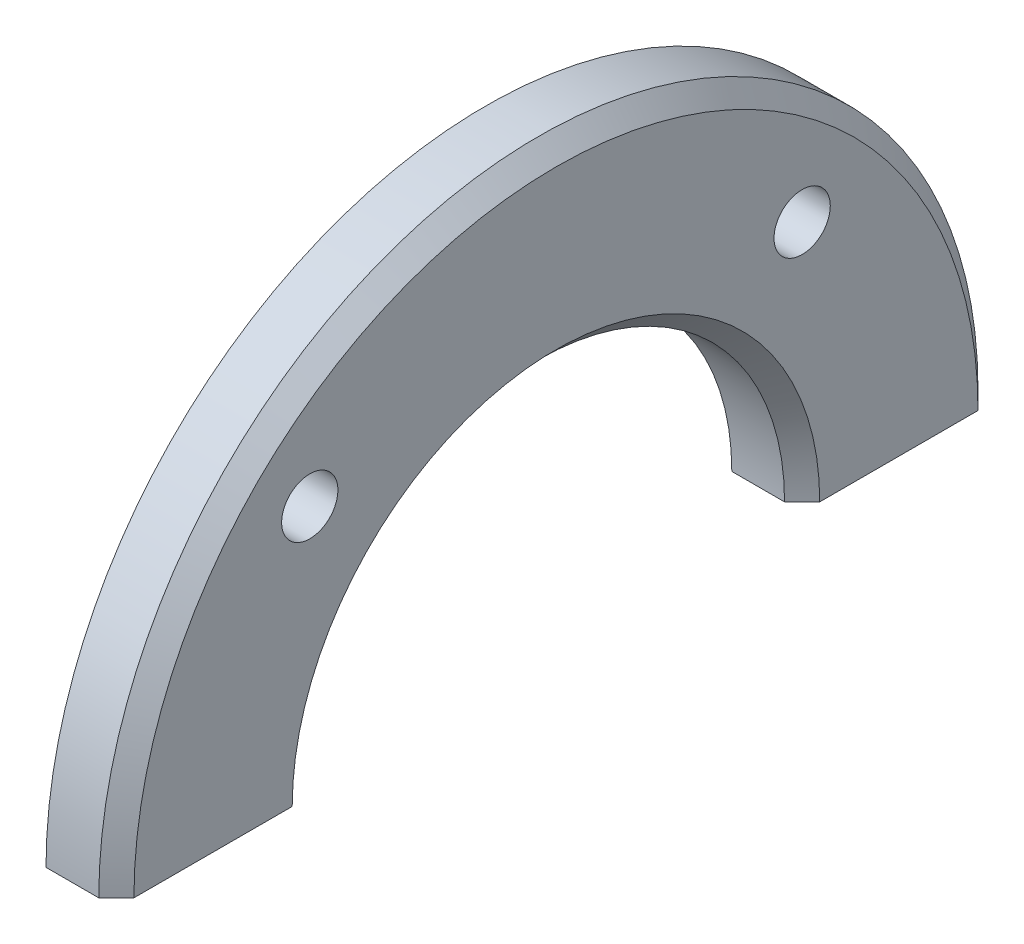
ISO-10303-21;
HEADER;
FILE_DESCRIPTION(('STEP AP214'),'2;1');
FILE_NAME('part.step','',(''),(''),'','','');
FILE_SCHEMA(('AUTOMOTIVE_DESIGN { 1 0 10303 214 1 1 1 1 }'));
ENDSEC;
DATA;
#1=APPLICATION_CONTEXT('core data for automotive mechanical design processes');
#2=APPLICATION_PROTOCOL_DEFINITION('international standard','automotive_design',2000,#1);
#3=PRODUCT_CONTEXT('',#1,'mechanical');
#4=PRODUCT('Part','Part','',(#3));
#5=PRODUCT_RELATED_PRODUCT_CATEGORY('part','',(#4));
#6=PRODUCT_DEFINITION_FORMATION('','',#4);
#7=PRODUCT_DEFINITION_CONTEXT('part definition',#1,'design');
#8=PRODUCT_DEFINITION('design','',#6,#7);
#9=PRODUCT_DEFINITION_SHAPE('','',#8);
#10=(LENGTH_UNIT() NAMED_UNIT(*) SI_UNIT(.MILLI.,.METRE.));
#11=(NAMED_UNIT(*) PLANE_ANGLE_UNIT() SI_UNIT($,.RADIAN.));
#12=(NAMED_UNIT(*) SI_UNIT($,.STERADIAN.) SOLID_ANGLE_UNIT());
#13=UNCERTAINTY_MEASURE_WITH_UNIT(LENGTH_MEASURE(1.E-05),#10,'distance_accuracy_value','');
#14=(GEOMETRIC_REPRESENTATION_CONTEXT(3) GLOBAL_UNCERTAINTY_ASSIGNED_CONTEXT((#13)) GLOBAL_UNIT_ASSIGNED_CONTEXT((#10,
#11,#12)) REPRESENTATION_CONTEXT('',''));
#15=CARTESIAN_POINT('',(0.,0.,0.));
#16=DIRECTION('',(0.,0.,1.));
#17=DIRECTION('',(1.,0.,0.));
#18=AXIS2_PLACEMENT_3D('',#15,#16,#17);
#19=CARTESIAN_POINT('',(4.,0.,0.));
#20=DIRECTION('',(1.,0.,0.));
#21=DIRECTION('',(0.,0.,-1.));
#22=AXIS2_PLACEMENT_3D('',#19,#20,#21);
#23=PLANE('',#22);
#24=CARTESIAN_POINT('',(4.,14.2828568570857,-14.));
#25=DIRECTION('',(1.,0.,0.));
#26=DIRECTION('',(0.,0.,-1.));
#27=AXIS2_PLACEMENT_3D('',#24,#25,#26);
#28=CIRCLE('',#27,1.6);
#29=CARTESIAN_POINT('',(4.,14.2828568570857,-15.6));
#30=VERTEX_POINT('',#29);
#31=EDGE_CURVE('E125',#30,#30,#28,.T.);
#32=ORIENTED_EDGE('',*,*,#31,.F.);
#33=EDGE_LOOP('',(#32));
#34=FACE_BOUND('',#33,.T.);
#35=DIRECTION('',(0.,0.,-1.));
#36=VECTOR('',#35,1.);
#37=CARTESIAN_POINT('',(4.,0.,14.));
#38=LINE('',#37,#36);
#39=CARTESIAN_POINT('',(4.,0.,24.));
#40=VERTEX_POINT('',#39);
#41=CARTESIAN_POINT('',(4.,0.,15.));
#42=VERTEX_POINT('',#41);
#43=EDGE_CURVE('E132',#40,#42,#38,.T.);
#44=ORIENTED_EDGE('',*,*,#43,.T.);
#45=CARTESIAN_POINT('',(4.,0.,0.));
#46=DIRECTION('',(1.,0.,0.));
#47=DIRECTION('',(0.,0.,-1.));
#48=AXIS2_PLACEMENT_3D('',#45,#46,#47);
#49=CIRCLE('',#48,15.);
#50=CARTESIAN_POINT('',(4.,0.,-15.));
#51=VERTEX_POINT('',#50);
#52=EDGE_CURVE('E151',#42,#51,#49,.F.);
#53=ORIENTED_EDGE('',*,*,#52,.T.);
#54=DIRECTION('',(0.,0.,-1.));
#55=VECTOR('',#54,1.);
#56=CARTESIAN_POINT('',(4.,0.,-14.));
#57=LINE('',#56,#55);
#58=CARTESIAN_POINT('',(4.,0.,-24.));
#59=VERTEX_POINT('',#58);
#60=EDGE_CURVE('E140',#51,#59,#57,.T.);
#61=ORIENTED_EDGE('',*,*,#60,.T.);
#62=CARTESIAN_POINT('',(4.,0.,0.));
#63=DIRECTION('',(1.,0.,0.));
#64=DIRECTION('',(0.,0.,-1.));
#65=AXIS2_PLACEMENT_3D('',#62,#63,#64);
#66=CIRCLE('',#65,24.);
#67=EDGE_CURVE('E108',#59,#40,#66,.T.);
#68=ORIENTED_EDGE('',*,*,#67,.T.);
#69=EDGE_LOOP('',(#44,#53,#61,#68));
#70=FACE_BOUND('',#69,.T.);
#71=CARTESIAN_POINT('',(4.,14.2828568570857,14.));
#72=DIRECTION('',(1.,0.,0.));
#73=DIRECTION('',(0.,0.,-1.));
#74=AXIS2_PLACEMENT_3D('',#71,#72,#73);
#75=CIRCLE('',#74,1.6);
#76=CARTESIAN_POINT('',(4.,14.2828568570857,12.4));
#77=VERTEX_POINT('',#76);
#78=EDGE_CURVE('E293',#77,#77,#75,.T.);
#79=ORIENTED_EDGE('',*,*,#78,.F.);
#80=EDGE_LOOP('',(#79));
#81=FACE_BOUND('',#80,.T.);
#82=ADVANCED_FACE('F44',(#34,#70,#81),#23,.T.);
#83=CARTESIAN_POINT('',(0.,0.,0.));
#84=DIRECTION('',(1.,0.,0.));
#85=DIRECTION('',(0.,0.,-1.));
#86=AXIS2_PLACEMENT_3D('',#83,#84,#85);
#87=PLANE('',#86);
#88=CARTESIAN_POINT('',(0.,0.,0.));
#89=DIRECTION('',(-1.,0.,0.));
#90=DIRECTION('',(0.,0.,-1.));
#91=AXIS2_PLACEMENT_3D('',#88,#89,#90);
#92=CIRCLE('',#91,14.);
#93=CARTESIAN_POINT('',(0.,0.,14.));
#94=VERTEX_POINT('',#93);
#95=CARTESIAN_POINT('',(0.,0.,-14.));
#96=VERTEX_POINT('',#95);
#97=EDGE_CURVE('E116',#94,#96,#92,.T.);
#98=ORIENTED_EDGE('',*,*,#97,.F.);
#99=DIRECTION('',(0.,0.,-1.));
#100=VECTOR('',#99,1.);
#101=CARTESIAN_POINT('',(0.,0.,14.));
#102=LINE('',#101,#100);
#103=CARTESIAN_POINT('',(0.,0.,25.));
#104=VERTEX_POINT('',#103);
#105=EDGE_CURVE('E137',#104,#94,#102,.T.);
#106=ORIENTED_EDGE('',*,*,#105,.F.);
#107=CARTESIAN_POINT('',(0.,0.,0.));
#108=DIRECTION('',(1.,0.,0.));
#109=DIRECTION('',(0.,0.,-1.));
#110=AXIS2_PLACEMENT_3D('',#107,#108,#109);
#111=CIRCLE('',#110,25.);
#112=CARTESIAN_POINT('',(0.,0.,-25.));
#113=VERTEX_POINT('',#112);
#114=EDGE_CURVE('E118',#113,#104,#111,.T.);
#115=ORIENTED_EDGE('',*,*,#114,.F.);
#116=DIRECTION('',(0.,0.,-1.));
#117=VECTOR('',#116,1.);
#118=CARTESIAN_POINT('',(0.,0.,-14.));
#119=LINE('',#118,#117);
#120=EDGE_CURVE('E103',#96,#113,#119,.T.);
#121=ORIENTED_EDGE('',*,*,#120,.F.);
#122=EDGE_LOOP('',(#98,#106,#115,#121));
#123=FACE_BOUND('',#122,.T.);
#124=CARTESIAN_POINT('',(0.,14.2828568570857,-14.));
#125=DIRECTION('',(1.,0.,0.));
#126=DIRECTION('',(0.,0.,-1.));
#127=AXIS2_PLACEMENT_3D('',#124,#125,#126);
#128=CIRCLE('',#127,1.6);
#129=CARTESIAN_POINT('',(0.,14.2828568570857,-15.6));
#130=VERTEX_POINT('',#129);
#131=EDGE_CURVE('E129',#130,#130,#128,.T.);
#132=ORIENTED_EDGE('',*,*,#131,.T.);
#133=EDGE_LOOP('',(#132));
#134=FACE_BOUND('',#133,.T.);
#135=CARTESIAN_POINT('',(0.,14.2828568570857,14.));
#136=DIRECTION('',(1.,0.,0.));
#137=DIRECTION('',(0.,0.,-1.));
#138=AXIS2_PLACEMENT_3D('',#135,#136,#137);
#139=CIRCLE('',#138,1.6);
#140=CARTESIAN_POINT('',(0.,14.2828568570857,12.4));
#141=VERTEX_POINT('',#140);
#142=EDGE_CURVE('E297',#141,#141,#139,.T.);
#143=ORIENTED_EDGE('',*,*,#142,.T.);
#144=EDGE_LOOP('',(#143));
#145=FACE_BOUND('',#144,.T.);
#146=ADVANCED_FACE('F113',(#123,#134,#145),#87,.F.);
#147=CARTESIAN_POINT('',(4.,0.,0.));
#148=DIRECTION('',(-1.,0.,0.));
#149=DIRECTION('',(0.,0.,1.));
#150=AXIS2_PLACEMENT_3D('',#147,#148,#149);
#151=CYLINDRICAL_SURFACE('',#150,14.);
#152=DIRECTION('',(-1.,0.,0.));
#153=VECTOR('',#152,1.);
#154=CARTESIAN_POINT('',(4.,0.,-14.));
#155=LINE('',#154,#153);
#156=CARTESIAN_POINT('',(2.99999999999998,0.,-14.));
#157=VERTEX_POINT('',#156);
#158=EDGE_CURVE('E98',#157,#96,#155,.T.);
#159=ORIENTED_EDGE('',*,*,#158,.F.);
#160=CARTESIAN_POINT('',(2.99999999999998,0.,0.));
#161=DIRECTION('',(1.,0.,0.));
#162=DIRECTION('',(0.,0.,-1.));
#163=AXIS2_PLACEMENT_3D('',#160,#161,#162);
#164=CIRCLE('',#163,14.);
#165=CARTESIAN_POINT('',(2.99999999999998,0.,14.));
#166=VERTEX_POINT('',#165);
#167=EDGE_CURVE('E69',#157,#166,#164,.T.);
#168=ORIENTED_EDGE('',*,*,#167,.T.);
#169=DIRECTION('',(-1.,0.,0.));
#170=VECTOR('',#169,1.);
#171=CARTESIAN_POINT('',(4.,0.,14.));
#172=LINE('',#171,#170);
#173=EDGE_CURVE('E122',#166,#94,#172,.T.);
#174=ORIENTED_EDGE('',*,*,#173,.T.);
#175=ORIENTED_EDGE('',*,*,#97,.T.);
#176=EDGE_LOOP('',(#159,#168,#174,#175));
#177=FACE_BOUND('',#176,.T.);
#178=ADVANCED_FACE('F121',(#177),#151,.F.);
#179=CARTESIAN_POINT('',(4.,0.,-14.));
#180=DIRECTION('',(0.,1.,0.));
#181=DIRECTION('',(0.,0.,1.));
#182=AXIS2_PLACEMENT_3D('',#179,#180,#181);
#183=PLANE('',#182);
#184=ORIENTED_EDGE('',*,*,#60,.F.);
#185=DIRECTION('',(-0.707106781186551,0.,0.707106781186544));
#186=VECTOR('',#185,1.);
#187=CARTESIAN_POINT('',(-11.0000000000001,0.,0.));
#188=LINE('',#187,#186);
#189=EDGE_CURVE('E105',#51,#157,#188,.T.);
#190=ORIENTED_EDGE('',*,*,#189,.T.);
#191=ORIENTED_EDGE('',*,*,#158,.T.);
#192=ORIENTED_EDGE('',*,*,#120,.T.);
#193=DIRECTION('',(-1.,0.,0.));
#194=VECTOR('',#193,1.);
#195=CARTESIAN_POINT('',(4.,0.,-25.));
#196=LINE('',#195,#194);
#197=CARTESIAN_POINT('',(3.,0.,-25.));
#198=VERTEX_POINT('',#197);
#199=EDGE_CURVE('E109',#198,#113,#196,.T.);
#200=ORIENTED_EDGE('',*,*,#199,.F.);
#201=DIRECTION('',(-0.707106781186549,0.,-0.707106781186546));
#202=VECTOR('',#201,1.);
#203=CARTESIAN_POINT('',(28.0000000000001,0.,0.));
#204=LINE('',#203,#202);
#205=EDGE_CURVE('E155',#198,#59,#204,.F.);
#206=ORIENTED_EDGE('',*,*,#205,.T.);
#207=EDGE_LOOP('',(#184,#190,#191,#192,#200,#206));
#208=FACE_BOUND('',#207,.T.);
#209=ADVANCED_FACE('F101',(#208),#183,.F.);
#210=CARTESIAN_POINT('',(4.,0.,0.));
#211=DIRECTION('',(-1.,0.,0.));
#212=DIRECTION('',(0.,0.,1.));
#213=AXIS2_PLACEMENT_3D('',#210,#211,#212);
#214=CYLINDRICAL_SURFACE('',#213,25.);
#215=DIRECTION('',(-1.,0.,0.));
#216=VECTOR('',#215,1.);
#217=CARTESIAN_POINT('',(4.,0.,25.));
#218=LINE('',#217,#216);
#219=CARTESIAN_POINT('',(3.,0.,25.));
#220=VERTEX_POINT('',#219);
#221=EDGE_CURVE('E143',#220,#104,#218,.T.);
#222=ORIENTED_EDGE('',*,*,#221,.F.);
#223=CARTESIAN_POINT('',(3.,0.,0.));
#224=DIRECTION('',(1.,0.,0.));
#225=DIRECTION('',(0.,0.,-1.));
#226=AXIS2_PLACEMENT_3D('',#223,#224,#225);
#227=CIRCLE('',#226,25.);
#228=EDGE_CURVE('E11',#220,#198,#227,.F.);
#229=ORIENTED_EDGE('',*,*,#228,.T.);
#230=ORIENTED_EDGE('',*,*,#199,.T.);
#231=ORIENTED_EDGE('',*,*,#114,.T.);
#232=EDGE_LOOP('',(#222,#229,#230,#231));
#233=FACE_BOUND('',#232,.T.);
#234=ADVANCED_FACE('F199',(#233),#214,.T.);
#235=CARTESIAN_POINT('',(4.,0.,14.));
#236=DIRECTION('',(0.,1.,0.));
#237=DIRECTION('',(0.,0.,1.));
#238=AXIS2_PLACEMENT_3D('',#235,#236,#237);
#239=PLANE('',#238);
#240=ORIENTED_EDGE('',*,*,#173,.F.);
#241=DIRECTION('',(0.707106781186551,0.,0.707106781186544));
#242=VECTOR('',#241,1.);
#243=CARTESIAN_POINT('',(-11.0000000000001,0.,0.));
#244=LINE('',#243,#242);
#245=EDGE_CURVE('E54',#166,#42,#244,.T.);
#246=ORIENTED_EDGE('',*,*,#245,.T.);
#247=ORIENTED_EDGE('',*,*,#43,.F.);
#248=DIRECTION('',(0.707106781186549,0.,-0.707106781186546));
#249=VECTOR('',#248,1.);
#250=CARTESIAN_POINT('',(28.0000000000001,0.,0.));
#251=LINE('',#250,#249);
#252=EDGE_CURVE('E61',#40,#220,#251,.F.);
#253=ORIENTED_EDGE('',*,*,#252,.T.);
#254=ORIENTED_EDGE('',*,*,#221,.T.);
#255=ORIENTED_EDGE('',*,*,#105,.T.);
#256=EDGE_LOOP('',(#240,#246,#247,#253,#254,#255));
#257=FACE_BOUND('',#256,.T.);
#258=ADVANCED_FACE('F166',(#257),#239,.F.);
#259=CARTESIAN_POINT('',(4.,14.2828568570857,-14.));
#260=DIRECTION('',(-1.,0.,0.));
#261=DIRECTION('',(0.,0.,1.));
#262=AXIS2_PLACEMENT_3D('',#259,#260,#261);
#263=CYLINDRICAL_SURFACE('',#262,1.6);
#264=ORIENTED_EDGE('',*,*,#31,.T.);
#265=EDGE_LOOP('',(#264));
#266=FACE_BOUND('',#265,.T.);
#267=ORIENTED_EDGE('',*,*,#131,.F.);
#268=EDGE_LOOP('',(#267));
#269=FACE_BOUND('',#268,.T.);
#270=ADVANCED_FACE('F182',(#266,#269),#263,.F.);
#271=CARTESIAN_POINT('',(4.,14.2828568570857,14.));
#272=DIRECTION('',(-1.,0.,0.));
#273=DIRECTION('',(0.,0.,1.));
#274=AXIS2_PLACEMENT_3D('',#271,#272,#273);
#275=CYLINDRICAL_SURFACE('',#274,1.6);
#276=ORIENTED_EDGE('',*,*,#78,.T.);
#277=EDGE_LOOP('',(#276));
#278=FACE_BOUND('',#277,.T.);
#279=ORIENTED_EDGE('',*,*,#142,.F.);
#280=EDGE_LOOP('',(#279));
#281=FACE_BOUND('',#280,.T.);
#282=ADVANCED_FACE('F176',(#278,#281),#275,.F.);
#283=CARTESIAN_POINT('',(4.,0.,0.));
#284=DIRECTION('',(1.,0.,0.));
#285=DIRECTION('',(0.,0.,-1.));
#286=AXIS2_PLACEMENT_3D('',#283,#284,#285);
#287=CONICAL_SURFACE('',#286,15.,0.785398163397444);
#288=ORIENTED_EDGE('',*,*,#245,.F.);
#289=ORIENTED_EDGE('',*,*,#167,.F.);
#290=ORIENTED_EDGE('',*,*,#189,.F.);
#291=ORIENTED_EDGE('',*,*,#52,.F.);
#292=EDGE_LOOP('',(#288,#289,#290,#291));
#293=FACE_BOUND('',#292,.T.);
#294=ADVANCED_FACE('F174',(#293),#287,.F.);
#295=CARTESIAN_POINT('',(4.,0.,0.));
#296=DIRECTION('',(-1.,0.,0.));
#297=DIRECTION('',(0.,0.,1.));
#298=AXIS2_PLACEMENT_3D('',#295,#296,#297);
#299=CONICAL_SURFACE('',#298,24.,0.785398163397447);
#300=ORIENTED_EDGE('',*,*,#205,.F.);
#301=ORIENTED_EDGE('',*,*,#228,.F.);
#302=ORIENTED_EDGE('',*,*,#252,.F.);
#303=ORIENTED_EDGE('',*,*,#67,.F.);
#304=EDGE_LOOP('',(#300,#301,#302,#303));
#305=FACE_BOUND('',#304,.T.);
#306=ADVANCED_FACE('F47',(#305),#299,.T.);
#307=CLOSED_SHELL('',(#82,#146,#178,#209,#234,#258,#270,#282,#294,#306));
#308=MANIFOLD_SOLID_BREP('B2',#307);
#309=ADVANCED_BREP_SHAPE_REPRESENTATION('',(#18,#308),#14);
#310=SHAPE_DEFINITION_REPRESENTATION(#9,#309);
ENDSEC;
END-ISO-10303-21;
